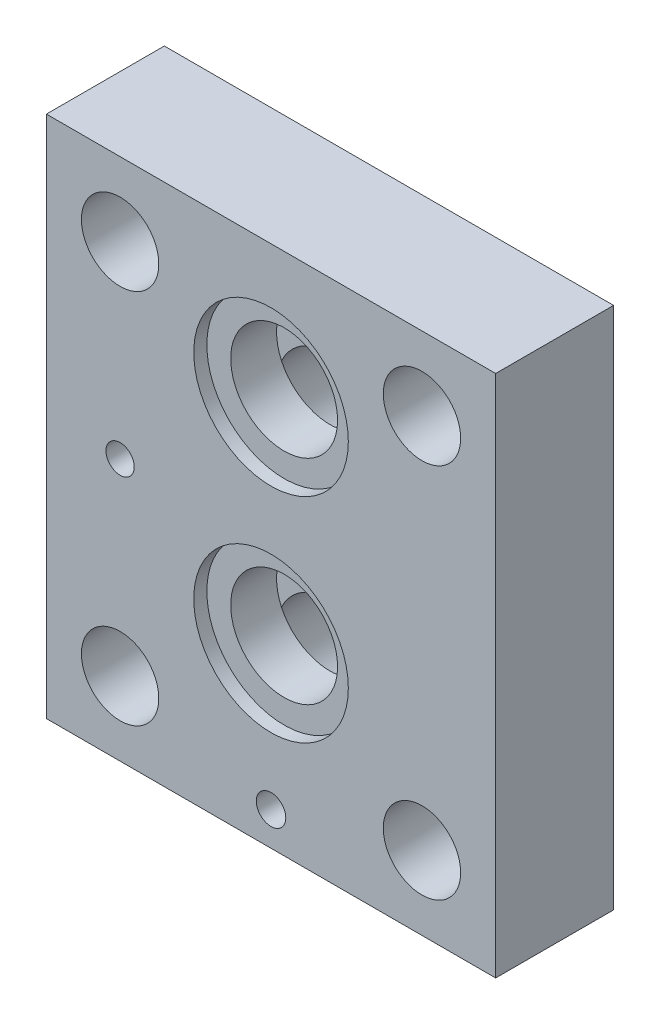
ISO-10303-21;
HEADER;
FILE_DESCRIPTION(('STEP AP214'),'2;1');
FILE_NAME('part.step','',(''),(''),'','','');
FILE_SCHEMA(('AUTOMOTIVE_DESIGN { 1 0 10303 214 1 1 1 1 }'));
ENDSEC;
DATA;
#1=APPLICATION_CONTEXT('core data for automotive mechanical design processes');
#2=APPLICATION_PROTOCOL_DEFINITION('international standard','automotive_design',2000,#1);
#3=PRODUCT_CONTEXT('',#1,'mechanical');
#4=PRODUCT('Part','Part','',(#3));
#5=PRODUCT_RELATED_PRODUCT_CATEGORY('part','',(#4));
#6=PRODUCT_DEFINITION_FORMATION('','',#4);
#7=PRODUCT_DEFINITION_CONTEXT('part definition',#1,'design');
#8=PRODUCT_DEFINITION('design','',#6,#7);
#9=PRODUCT_DEFINITION_SHAPE('','',#8);
#10=(LENGTH_UNIT() NAMED_UNIT(*) SI_UNIT(.MILLI.,.METRE.));
#11=(NAMED_UNIT(*) PLANE_ANGLE_UNIT() SI_UNIT($,.RADIAN.));
#12=(NAMED_UNIT(*) SI_UNIT($,.STERADIAN.) SOLID_ANGLE_UNIT());
#13=UNCERTAINTY_MEASURE_WITH_UNIT(LENGTH_MEASURE(1.E-05),#10,'distance_accuracy_value','');
#14=(GEOMETRIC_REPRESENTATION_CONTEXT(3) GLOBAL_UNCERTAINTY_ASSIGNED_CONTEXT((#13)) GLOBAL_UNIT_ASSIGNED_CONTEXT((#10,
#11,#12)) REPRESENTATION_CONTEXT('',''));
#15=CARTESIAN_POINT('',(0.,0.,0.));
#16=DIRECTION('',(0.,0.,1.));
#17=DIRECTION('',(1.,0.,0.));
#18=AXIS2_PLACEMENT_3D('',#15,#16,#17);
#19=CARTESIAN_POINT('',(0.,27.813,0.));
#20=DIRECTION('',(0.,0.,1.));
#21=DIRECTION('',(1.,0.,0.));
#22=AXIS2_PLACEMENT_3D('',#19,#20,#21);
#23=CYLINDRICAL_SURFACE('',#22,11.509375);
#24=CARTESIAN_POINT('',(0.,27.813,0.));
#25=DIRECTION('',(0.,0.,1.));
#26=DIRECTION('',(1.,0.,0.));
#27=AXIS2_PLACEMENT_3D('',#24,#25,#26);
#28=CIRCLE('',#27,11.509375);
#29=CARTESIAN_POINT('',(-10.4487050341478,22.987,0.));
#30=VERTEX_POINT('',#29);
#31=CARTESIAN_POINT('',(10.4487050341478,22.987,0.));
#32=VERTEX_POINT('',#31);
#33=EDGE_CURVE('E100',#30,#32,#28,.T.);
#34=ORIENTED_EDGE('',*,*,#33,.F.);
#35=EDGE_CURVE('E59',#32,#30,#28,.T.);
#36=ORIENTED_EDGE('',*,*,#35,.F.);
#37=EDGE_LOOP('',(#34,#36));
#38=FACE_BOUND('',#37,.T.);
#39=CARTESIAN_POINT('',(0.,27.813,9.8806));
#40=DIRECTION('',(0.,0.,1.));
#41=DIRECTION('',(1.,0.,0.));
#42=AXIS2_PLACEMENT_3D('',#39,#40,#41);
#43=CIRCLE('',#42,11.509375);
#44=CARTESIAN_POINT('',(11.509375,27.813,9.8806));
#45=VERTEX_POINT('',#44);
#46=EDGE_CURVE('E47',#45,#45,#43,.F.);
#47=ORIENTED_EDGE('',*,*,#46,.F.);
#48=EDGE_LOOP('',(#47));
#49=FACE_BOUND('',#48,.T.);
#50=ADVANCED_FACE('F43',(#38,#49),#23,.F.);
#51=CARTESIAN_POINT('',(0.,-18.161,0.));
#52=DIRECTION('',(0.,0.,1.));
#53=DIRECTION('',(1.,0.,0.));
#54=AXIS2_PLACEMENT_3D('',#51,#52,#53);
#55=CYLINDRICAL_SURFACE('',#54,11.509375);
#56=CARTESIAN_POINT('',(0.,-18.161,0.));
#57=DIRECTION('',(0.,0.,1.));
#58=DIRECTION('',(1.,0.,0.));
#59=AXIS2_PLACEMENT_3D('',#56,#57,#58);
#60=CIRCLE('',#59,11.509375);
#61=CARTESIAN_POINT('',(-10.4487050341478,-22.987,0.));
#62=VERTEX_POINT('',#61);
#63=CARTESIAN_POINT('',(10.4487050341478,-22.987,0.));
#64=VERTEX_POINT('',#63);
#65=EDGE_CURVE('E120',#62,#64,#60,.T.);
#66=ORIENTED_EDGE('',*,*,#65,.F.);
#67=EDGE_CURVE('E66',#64,#62,#60,.T.);
#68=ORIENTED_EDGE('',*,*,#67,.F.);
#69=EDGE_LOOP('',(#66,#68));
#70=FACE_BOUND('',#69,.T.);
#71=CARTESIAN_POINT('',(0.,-18.161,9.8806));
#72=DIRECTION('',(0.,0.,1.));
#73=DIRECTION('',(1.,0.,0.));
#74=AXIS2_PLACEMENT_3D('',#71,#72,#73);
#75=CIRCLE('',#74,11.509375);
#76=CARTESIAN_POINT('',(11.509375,-18.161,9.8806));
#77=VERTEX_POINT('',#76);
#78=EDGE_CURVE('E101',#77,#77,#75,.F.);
#79=ORIENTED_EDGE('',*,*,#78,.F.);
#80=EDGE_LOOP('',(#79));
#81=FACE_BOUND('',#80,.T.);
#82=ADVANCED_FACE('F279',(#70,#81),#55,.F.);
#83=CARTESIAN_POINT('',(48.387,56.388,12.7));
#84=DIRECTION('',(0.,-1.,0.));
#85=DIRECTION('',(0.,0.,-1.));
#86=AXIS2_PLACEMENT_3D('',#83,#84,#85);
#87=PLANE('',#86);
#88=DIRECTION('',(-1.,0.,0.));
#89=VECTOR('',#88,1.);
#90=CARTESIAN_POINT('',(48.387,56.388,-12.7));
#91=LINE('',#90,#89);
#92=CARTESIAN_POINT('',(48.387,56.388,-12.7));
#93=VERTEX_POINT('',#92);
#94=CARTESIAN_POINT('',(-48.387,56.388,-12.7));
#95=VERTEX_POINT('',#94);
#96=EDGE_CURVE('E148',#93,#95,#91,.T.);
#97=ORIENTED_EDGE('',*,*,#96,.T.);
#98=DIRECTION('',(0.,0.,-1.));
#99=VECTOR('',#98,1.);
#100=CARTESIAN_POINT('',(-48.387,56.388,12.7));
#101=LINE('',#100,#99);
#102=CARTESIAN_POINT('',(-48.387,56.388,12.7));
#103=VERTEX_POINT('',#102);
#104=EDGE_CURVE('E11',#103,#95,#101,.T.);
#105=ORIENTED_EDGE('',*,*,#104,.F.);
#106=DIRECTION('',(-1.,0.,0.));
#107=VECTOR('',#106,1.);
#108=CARTESIAN_POINT('',(48.387,56.388,12.7));
#109=LINE('',#108,#107);
#110=CARTESIAN_POINT('',(48.387,56.388,12.7));
#111=VERTEX_POINT('',#110);
#112=EDGE_CURVE('E151',#111,#103,#109,.T.);
#113=ORIENTED_EDGE('',*,*,#112,.F.);
#114=DIRECTION('',(0.,0.,-1.));
#115=VECTOR('',#114,1.);
#116=CARTESIAN_POINT('',(48.387,56.388,12.7));
#117=LINE('',#116,#115);
#118=EDGE_CURVE('E161',#111,#93,#117,.T.);
#119=ORIENTED_EDGE('',*,*,#118,.T.);
#120=EDGE_LOOP('',(#97,#105,#113,#119));
#121=FACE_BOUND('',#120,.T.);
#122=ADVANCED_FACE('F45',(#121),#87,.F.);
#123=CARTESIAN_POINT('',(-48.387,-56.388,12.7));
#124=DIRECTION('',(1.,0.,0.));
#125=DIRECTION('',(0.,0.,-1.));
#126=AXIS2_PLACEMENT_3D('',#123,#124,#125);
#127=PLANE('',#126);
#128=DIRECTION('',(0.,-1.,0.));
#129=VECTOR('',#128,1.);
#130=CARTESIAN_POINT('',(-48.387,-56.388,-12.7));
#131=LINE('',#130,#129);
#132=CARTESIAN_POINT('',(-48.387,-56.388,-12.7));
#133=VERTEX_POINT('',#132);
#134=EDGE_CURVE('E164',#95,#133,#131,.T.);
#135=ORIENTED_EDGE('',*,*,#134,.T.);
#136=DIRECTION('',(0.,0.,-1.));
#137=VECTOR('',#136,1.);
#138=CARTESIAN_POINT('',(-48.387,-56.388,12.7));
#139=LINE('',#138,#137);
#140=CARTESIAN_POINT('',(-48.387,-56.388,12.7));
#141=VERTEX_POINT('',#140);
#142=EDGE_CURVE('E52',#141,#133,#139,.T.);
#143=ORIENTED_EDGE('',*,*,#142,.F.);
#144=DIRECTION('',(0.,-1.,0.));
#145=VECTOR('',#144,1.);
#146=CARTESIAN_POINT('',(-48.387,-56.388,12.7));
#147=LINE('',#146,#145);
#148=EDGE_CURVE('E154',#103,#141,#147,.T.);
#149=ORIENTED_EDGE('',*,*,#148,.F.);
#150=ORIENTED_EDGE('',*,*,#104,.T.);
#151=EDGE_LOOP('',(#135,#143,#149,#150));
#152=FACE_BOUND('',#151,.T.);
#153=ADVANCED_FACE('F255',(#152),#127,.F.);
#154=CARTESIAN_POINT('',(48.387,-56.388,12.7));
#155=DIRECTION('',(0.,1.,0.));
#156=DIRECTION('',(0.,0.,1.));
#157=AXIS2_PLACEMENT_3D('',#154,#155,#156);
#158=PLANE('',#157);
#159=DIRECTION('',(1.,0.,0.));
#160=VECTOR('',#159,1.);
#161=CARTESIAN_POINT('',(48.387,-56.388,-12.7));
#162=LINE('',#161,#160);
#163=CARTESIAN_POINT('',(48.387,-56.388,-12.7));
#164=VERTEX_POINT('',#163);
#165=EDGE_CURVE('E166',#133,#164,#162,.T.);
#166=ORIENTED_EDGE('',*,*,#165,.T.);
#167=DIRECTION('',(0.,0.,-1.));
#168=VECTOR('',#167,1.);
#169=CARTESIAN_POINT('',(48.387,-56.388,12.7));
#170=LINE('',#169,#168);
#171=CARTESIAN_POINT('',(48.387,-56.388,12.7));
#172=VERTEX_POINT('',#171);
#173=EDGE_CURVE('E171',#172,#164,#170,.T.);
#174=ORIENTED_EDGE('',*,*,#173,.F.);
#175=DIRECTION('',(1.,0.,0.));
#176=VECTOR('',#175,1.);
#177=CARTESIAN_POINT('',(48.387,-56.388,12.7));
#178=LINE('',#177,#176);
#179=EDGE_CURVE('E157',#141,#172,#178,.T.);
#180=ORIENTED_EDGE('',*,*,#179,.F.);
#181=ORIENTED_EDGE('',*,*,#142,.T.);
#182=EDGE_LOOP('',(#166,#174,#180,#181));
#183=FACE_BOUND('',#182,.T.);
#184=ADVANCED_FACE('F260',(#183),#158,.F.);
#185=CARTESIAN_POINT('',(48.387,-56.388,12.7));
#186=DIRECTION('',(-1.,0.,0.));
#187=DIRECTION('',(0.,0.,1.));
#188=AXIS2_PLACEMENT_3D('',#185,#186,#187);
#189=PLANE('',#188);
#190=DIRECTION('',(0.,1.,0.));
#191=VECTOR('',#190,1.);
#192=CARTESIAN_POINT('',(48.387,-56.388,-12.7));
#193=LINE('',#192,#191);
#194=EDGE_CURVE('E155',#164,#93,#193,.T.);
#195=ORIENTED_EDGE('',*,*,#194,.T.);
#196=ORIENTED_EDGE('',*,*,#118,.F.);
#197=DIRECTION('',(0.,1.,0.));
#198=VECTOR('',#197,1.);
#199=CARTESIAN_POINT('',(48.387,-56.388,12.7));
#200=LINE('',#199,#198);
#201=EDGE_CURVE('E159',#172,#111,#200,.T.);
#202=ORIENTED_EDGE('',*,*,#201,.F.);
#203=ORIENTED_EDGE('',*,*,#173,.T.);
#204=EDGE_LOOP('',(#195,#196,#202,#203));
#205=FACE_BOUND('',#204,.T.);
#206=ADVANCED_FACE('F231',(#205),#189,.F.);
#207=CARTESIAN_POINT('',(0.,0.,12.7));
#208=DIRECTION('',(0.,0.,-1.));
#209=DIRECTION('',(-1.,0.,0.));
#210=AXIS2_PLACEMENT_3D('',#207,#208,#209);
#211=PLANE('',#210);
#212=CARTESIAN_POINT('',(-32.512,0.,12.7));
#213=DIRECTION('',(0.,0.,1.));
#214=DIRECTION('',(1.,0.,0.));
#215=AXIS2_PLACEMENT_3D('',#212,#213,#214);
#216=CIRCLE('',#215,3.04799999999999);
#217=CARTESIAN_POINT('',(-29.464,0.,12.7));
#218=VERTEX_POINT('',#217);
#219=EDGE_CURVE('E212',#218,#218,#216,.T.);
#220=ORIENTED_EDGE('',*,*,#219,.F.);
#221=EDGE_LOOP('',(#220));
#222=FACE_BOUND('',#221,.T.);
#223=CARTESIAN_POINT('',(0.,-49.149,12.7));
#224=DIRECTION('',(0.,0.,1.));
#225=DIRECTION('',(1.,0.,0.));
#226=AXIS2_PLACEMENT_3D('',#223,#224,#225);
#227=CIRCLE('',#226,3.175);
#228=CARTESIAN_POINT('',(3.175,-49.149,12.7));
#229=VERTEX_POINT('',#228);
#230=EDGE_CURVE('E206',#229,#229,#227,.T.);
#231=ORIENTED_EDGE('',*,*,#230,.F.);
#232=EDGE_LOOP('',(#231));
#233=FACE_BOUND('',#232,.T.);
#234=CARTESIAN_POINT('',(0.,27.813,12.7));
#235=DIRECTION('',(0.,0.,1.));
#236=DIRECTION('',(1.,0.,0.));
#237=AXIS2_PLACEMENT_3D('',#234,#235,#236);
#238=CIRCLE('',#237,16.6497);
#239=CARTESIAN_POINT('',(16.6497,27.813,12.7));
#240=VERTEX_POINT('',#239);
#241=EDGE_CURVE('E187',#240,#240,#238,.T.);
#242=ORIENTED_EDGE('',*,*,#241,.F.);
#243=EDGE_LOOP('',(#242));
#244=FACE_BOUND('',#243,.T.);
#245=CARTESIAN_POINT('',(0.,-18.161,12.7));
#246=DIRECTION('',(0.,0.,1.));
#247=DIRECTION('',(1.,0.,0.));
#248=AXIS2_PLACEMENT_3D('',#245,#246,#247);
#249=CIRCLE('',#248,16.6497);
#250=CARTESIAN_POINT('',(16.6497,-18.161,12.7));
#251=VERTEX_POINT('',#250);
#252=EDGE_CURVE('E180',#251,#251,#249,.T.);
#253=ORIENTED_EDGE('',*,*,#252,.F.);
#254=EDGE_LOOP('',(#253));
#255=FACE_BOUND('',#254,.T.);
#256=CARTESIAN_POINT('',(32.512,40.513,12.7));
#257=DIRECTION('',(0.,0.,-1.));
#258=DIRECTION('',(-1.,0.,0.));
#259=AXIS2_PLACEMENT_3D('',#256,#257,#258);
#260=CIRCLE('',#259,8.334375);
#261=CARTESIAN_POINT('',(24.177625,40.513,12.7));
#262=VERTEX_POINT('',#261);
#263=EDGE_CURVE('E131',#262,#262,#260,.T.);
#264=ORIENTED_EDGE('',*,*,#263,.T.);
#265=EDGE_LOOP('',(#264));
#266=FACE_BOUND('',#265,.T.);
#267=CARTESIAN_POINT('',(-32.512,-40.513,12.7));
#268=DIRECTION('',(0.,0.,-1.));
#269=DIRECTION('',(-1.,0.,0.));
#270=AXIS2_PLACEMENT_3D('',#267,#268,#269);
#271=CIRCLE('',#270,8.334375);
#272=CARTESIAN_POINT('',(-40.846375,-40.513,12.7));
#273=VERTEX_POINT('',#272);
#274=EDGE_CURVE('E134',#273,#273,#271,.T.);
#275=ORIENTED_EDGE('',*,*,#274,.T.);
#276=EDGE_LOOP('',(#275));
#277=FACE_BOUND('',#276,.T.);
#278=CARTESIAN_POINT('',(-32.512,40.513,12.7));
#279=DIRECTION('',(0.,0.,-1.));
#280=DIRECTION('',(-1.,0.,0.));
#281=AXIS2_PLACEMENT_3D('',#278,#279,#280);
#282=CIRCLE('',#281,8.334375);
#283=CARTESIAN_POINT('',(-40.846375,40.513,12.7));
#284=VERTEX_POINT('',#283);
#285=EDGE_CURVE('E140',#284,#284,#282,.T.);
#286=ORIENTED_EDGE('',*,*,#285,.T.);
#287=EDGE_LOOP('',(#286));
#288=FACE_BOUND('',#287,.T.);
#289=CARTESIAN_POINT('',(32.512,-40.513,12.7));
#290=DIRECTION('',(0.,0.,-1.));
#291=DIRECTION('',(-1.,0.,0.));
#292=AXIS2_PLACEMENT_3D('',#289,#290,#291);
#293=CIRCLE('',#292,8.334375);
#294=CARTESIAN_POINT('',(24.177625,-40.513,12.7));
#295=VERTEX_POINT('',#294);
#296=EDGE_CURVE('E130',#295,#295,#293,.T.);
#297=ORIENTED_EDGE('',*,*,#296,.T.);
#298=EDGE_LOOP('',(#297));
#299=FACE_BOUND('',#298,.T.);
#300=ORIENTED_EDGE('',*,*,#112,.T.);
#301=ORIENTED_EDGE('',*,*,#148,.T.);
#302=ORIENTED_EDGE('',*,*,#179,.T.);
#303=ORIENTED_EDGE('',*,*,#201,.T.);
#304=EDGE_LOOP('',(#300,#301,#302,#303));
#305=FACE_BOUND('',#304,.T.);
#306=ADVANCED_FACE('F227',(#222,#233,#244,#255,#266,#277,#288,#299,#305),#211,.F.);
#307=CARTESIAN_POINT('',(0.,0.,-12.7));
#308=DIRECTION('',(0.,0.,-1.));
#309=DIRECTION('',(-1.,0.,0.));
#310=AXIS2_PLACEMENT_3D('',#307,#308,#309);
#311=PLANE('',#310);
#312=CARTESIAN_POINT('',(32.512,0.,-12.7));
#313=DIRECTION('',(0.,0.,1.));
#314=DIRECTION('',(1.,0.,0.));
#315=AXIS2_PLACEMENT_3D('',#312,#313,#314);
#316=CIRCLE('',#315,3.69887499999999);
#317=CARTESIAN_POINT('',(36.210875,0.,-12.7));
#318=VERTEX_POINT('',#317);
#319=EDGE_CURVE('E200',#318,#318,#316,.T.);
#320=ORIENTED_EDGE('',*,*,#319,.T.);
#321=EDGE_LOOP('',(#320));
#322=FACE_BOUND('',#321,.T.);
#323=CARTESIAN_POINT('',(0.,49.149,-12.7));
#324=DIRECTION('',(0.,0.,1.));
#325=DIRECTION('',(1.,0.,0.));
#326=AXIS2_PLACEMENT_3D('',#323,#324,#325);
#327=CIRCLE('',#326,3.571875);
#328=CARTESIAN_POINT('',(3.571875,49.149,-12.7));
#329=VERTEX_POINT('',#328);
#330=EDGE_CURVE('E194',#329,#329,#327,.T.);
#331=ORIENTED_EDGE('',*,*,#330,.T.);
#332=EDGE_LOOP('',(#331));
#333=FACE_BOUND('',#332,.T.);
#334=CARTESIAN_POINT('',(0.,18.161,-12.7));
#335=DIRECTION('',(0.,0.,1.));
#336=DIRECTION('',(1.,0.,0.));
#337=AXIS2_PLACEMENT_3D('',#334,#335,#336);
#338=CIRCLE('',#337,11.509375);
#339=CARTESIAN_POINT('',(11.509375,18.161,-12.7));
#340=VERTEX_POINT('',#339);
#341=EDGE_CURVE('E110',#340,#340,#338,.T.);
#342=ORIENTED_EDGE('',*,*,#341,.T.);
#343=EDGE_LOOP('',(#342));
#344=FACE_BOUND('',#343,.T.);
#345=CARTESIAN_POINT('',(0.,-27.813,-12.7));
#346=DIRECTION('',(0.,0.,1.));
#347=DIRECTION('',(1.,0.,0.));
#348=AXIS2_PLACEMENT_3D('',#345,#346,#347);
#349=CIRCLE('',#348,11.509375);
#350=CARTESIAN_POINT('',(11.509375,-27.813,-12.7));
#351=VERTEX_POINT('',#350);
#352=EDGE_CURVE('E114',#351,#351,#349,.T.);
#353=ORIENTED_EDGE('',*,*,#352,.T.);
#354=EDGE_LOOP('',(#353));
#355=FACE_BOUND('',#354,.T.);
#356=CARTESIAN_POINT('',(32.512,40.513,-12.7));
#357=DIRECTION('',(0.,0.,1.));
#358=DIRECTION('',(1.,0.,0.));
#359=AXIS2_PLACEMENT_3D('',#356,#357,#358);
#360=CIRCLE('',#359,8.334375);
#361=CARTESIAN_POINT('',(24.177625,40.513,-12.7));
#362=VERTEX_POINT('',#361);
#363=EDGE_CURVE('E127',#362,#362,#360,.T.);
#364=ORIENTED_EDGE('',*,*,#363,.T.);
#365=EDGE_LOOP('',(#364));
#366=FACE_BOUND('',#365,.T.);
#367=CARTESIAN_POINT('',(-32.512,-40.513,-12.7));
#368=DIRECTION('',(0.,0.,1.));
#369=DIRECTION('',(1.,0.,0.));
#370=AXIS2_PLACEMENT_3D('',#367,#368,#369);
#371=CIRCLE('',#370,8.334375);
#372=CARTESIAN_POINT('',(-40.846375,-40.513,-12.7));
#373=VERTEX_POINT('',#372);
#374=EDGE_CURVE('E137',#373,#373,#371,.T.);
#375=ORIENTED_EDGE('',*,*,#374,.T.);
#376=EDGE_LOOP('',(#375));
#377=FACE_BOUND('',#376,.T.);
#378=CARTESIAN_POINT('',(-32.512,40.513,-12.7));
#379=DIRECTION('',(0.,0.,1.));
#380=DIRECTION('',(1.,0.,0.));
#381=AXIS2_PLACEMENT_3D('',#378,#379,#380);
#382=CIRCLE('',#381,8.334375);
#383=CARTESIAN_POINT('',(-40.846375,40.513,-12.7));
#384=VERTEX_POINT('',#383);
#385=EDGE_CURVE('E125',#384,#384,#382,.T.);
#386=ORIENTED_EDGE('',*,*,#385,.T.);
#387=EDGE_LOOP('',(#386));
#388=FACE_BOUND('',#387,.T.);
#389=CARTESIAN_POINT('',(32.512,-40.513,-12.7));
#390=DIRECTION('',(0.,0.,1.));
#391=DIRECTION('',(1.,0.,0.));
#392=AXIS2_PLACEMENT_3D('',#389,#390,#391);
#393=CIRCLE('',#392,8.334375);
#394=CARTESIAN_POINT('',(24.177625,-40.513,-12.7));
#395=VERTEX_POINT('',#394);
#396=EDGE_CURVE('E145',#395,#395,#393,.T.);
#397=ORIENTED_EDGE('',*,*,#396,.T.);
#398=EDGE_LOOP('',(#397));
#399=FACE_BOUND('',#398,.T.);
#400=ORIENTED_EDGE('',*,*,#96,.F.);
#401=ORIENTED_EDGE('',*,*,#194,.F.);
#402=ORIENTED_EDGE('',*,*,#165,.F.);
#403=ORIENTED_EDGE('',*,*,#134,.F.);
#404=EDGE_LOOP('',(#400,#401,#402,#403));
#405=FACE_BOUND('',#404,.T.);
#406=ADVANCED_FACE('F230',(#322,#333,#344,#355,#366,#377,#388,#399,#405),#311,.T.);
#407=CARTESIAN_POINT('',(32.512,-40.513,12.701));
#408=DIRECTION('',(0.,0.,-1.));
#409=DIRECTION('',(-1.,0.,0.));
#410=AXIS2_PLACEMENT_3D('',#407,#408,#409);
#411=CYLINDRICAL_SURFACE('',#410,8.334375);
#412=CARTESIAN_POINT('',(24.177625,-40.513,-12.7));
#413=CARTESIAN_POINT('',(24.177625,-40.513,-12.4354166666667));
#414=CARTESIAN_POINT('',(24.177625,-40.513,-12.1708333333333));
#415=CARTESIAN_POINT('',(24.177625,-40.513,-11.6416666666667));
#416=CARTESIAN_POINT('',(24.177625,-40.513,-11.3770833333333));
#417=CARTESIAN_POINT('',(24.177625,-40.513,-10.8479166666667));
#418=CARTESIAN_POINT('',(24.177625,-40.513,-10.5833333333333));
#419=CARTESIAN_POINT('',(24.177625,-40.513,-10.0541666666667));
#420=CARTESIAN_POINT('',(24.177625,-40.513,-9.78958333333334));
#421=CARTESIAN_POINT('',(24.177625,-40.513,-9.26041666666667));
#422=CARTESIAN_POINT('',(24.177625,-40.513,-8.99583333333334));
#423=CARTESIAN_POINT('',(24.177625,-40.513,-8.46666666666667));
#424=CARTESIAN_POINT('',(24.177625,-40.513,-8.20208333333333));
#425=CARTESIAN_POINT('',(24.177625,-40.513,-7.67291666666667));
#426=CARTESIAN_POINT('',(24.177625,-40.513,-7.40833333333333));
#427=CARTESIAN_POINT('',(24.177625,-40.513,-6.87916666666667));
#428=CARTESIAN_POINT('',(24.177625,-40.513,-6.61458333333333));
#429=CARTESIAN_POINT('',(24.177625,-40.513,-6.08541666666667));
#430=CARTESIAN_POINT('',(24.177625,-40.513,-5.82083333333333));
#431=CARTESIAN_POINT('',(24.177625,-40.513,-5.29166666666667));
#432=CARTESIAN_POINT('',(24.177625,-40.513,-5.02708333333334));
#433=CARTESIAN_POINT('',(24.177625,-40.513,-4.49791666666667));
#434=CARTESIAN_POINT('',(24.177625,-40.513,-4.23333333333333));
#435=CARTESIAN_POINT('',(24.177625,-40.513,-3.70416666666667));
#436=CARTESIAN_POINT('',(24.177625,-40.513,-3.43958333333333));
#437=CARTESIAN_POINT('',(24.177625,-40.513,-2.91041666666667));
#438=CARTESIAN_POINT('',(24.177625,-40.513,-2.64583333333334));
#439=CARTESIAN_POINT('',(24.177625,-40.513,-2.11666666666667));
#440=CARTESIAN_POINT('',(24.177625,-40.513,-1.85208333333334));
#441=CARTESIAN_POINT('',(24.177625,-40.513,-1.32291666666667));
#442=CARTESIAN_POINT('',(24.177625,-40.513,-1.05833333333333));
#443=CARTESIAN_POINT('',(24.177625,-40.513,-0.529166666666668));
#444=CARTESIAN_POINT('',(24.177625,-40.513,-0.264583333333335));
#445=CARTESIAN_POINT('',(24.177625,-40.513,0.264583333333331));
#446=CARTESIAN_POINT('',(24.177625,-40.513,0.529166666666664));
#447=CARTESIAN_POINT('',(24.177625,-40.513,1.05833333333333));
#448=CARTESIAN_POINT('',(24.177625,-40.513,1.32291666666666));
#449=CARTESIAN_POINT('',(24.177625,-40.513,1.85208333333333));
#450=CARTESIAN_POINT('',(24.177625,-40.513,2.11666666666667));
#451=CARTESIAN_POINT('',(24.177625,-40.513,2.64583333333333));
#452=CARTESIAN_POINT('',(24.177625,-40.513,2.91041666666667));
#453=CARTESIAN_POINT('',(24.177625,-40.513,3.43958333333333));
#454=CARTESIAN_POINT('',(24.177625,-40.513,3.70416666666667));
#455=CARTESIAN_POINT('',(24.177625,-40.513,4.23333333333333));
#456=CARTESIAN_POINT('',(24.177625,-40.513,4.49791666666667));
#457=CARTESIAN_POINT('',(24.177625,-40.513,5.02708333333333));
#458=CARTESIAN_POINT('',(24.177625,-40.513,5.29166666666667));
#459=CARTESIAN_POINT('',(24.177625,-40.513,5.82083333333333));
#460=CARTESIAN_POINT('',(24.177625,-40.513,6.08541666666667));
#461=CARTESIAN_POINT('',(24.177625,-40.513,6.61458333333333));
#462=CARTESIAN_POINT('',(24.177625,-40.513,6.87916666666667));
#463=CARTESIAN_POINT('',(24.177625,-40.513,7.40833333333333));
#464=CARTESIAN_POINT('',(24.177625,-40.513,7.67291666666666));
#465=CARTESIAN_POINT('',(24.177625,-40.513,8.20208333333333));
#466=CARTESIAN_POINT('',(24.177625,-40.513,8.46666666666667));
#467=CARTESIAN_POINT('',(24.177625,-40.513,8.99583333333333));
#468=CARTESIAN_POINT('',(24.177625,-40.513,9.26041666666666));
#469=CARTESIAN_POINT('',(24.177625,-40.513,9.78958333333333));
#470=CARTESIAN_POINT('',(24.177625,-40.513,10.0541666666667));
#471=CARTESIAN_POINT('',(24.177625,-40.513,10.5833333333333));
#472=CARTESIAN_POINT('',(24.177625,-40.513,10.8479166666667));
#473=CARTESIAN_POINT('',(24.177625,-40.513,11.3770833333333));
#474=CARTESIAN_POINT('',(24.177625,-40.513,11.6416666666667));
#475=CARTESIAN_POINT('',(24.177625,-40.513,12.1708333333333));
#476=CARTESIAN_POINT('',(24.177625,-40.513,12.4354166666667));
#477=CARTESIAN_POINT('',(24.177625,-40.513,12.7));
#478=B_SPLINE_CURVE_WITH_KNOTS('',3,(#412,#413,#414,#415,#416,#417,#418,#419,#420,#421,#422,
#423,#424,#425,#426,#427,#428,#429,#430,#431,#432,#433,#434,#435,#436,#437,#438,#439,#440,#441,
#442,#443,#444,#445,#446,#447,#448,#449,#450,#451,#452,#453,#454,#455,#456,#457,#458,#459,#460,
#461,#462,#463,#464,#465,#466,#467,#468,#469,#470,#471,#472,#473,#474,#475,#476,#477),
.UNSPECIFIED.,.F.,.F.,(4,2,2,2,2,2,2,2,2,2,2,2,2,2,2,2,2,2,2,2,2,2,2,2,2,2,2,2,2,2,2,2,4),(0.,
0.793749999999999,1.5875,2.38125,3.175,3.96875,4.7625,5.55625,6.35,7.14375,7.9375,8.73125,9.525,
10.31875,11.1125,11.90625,12.7,13.49375,14.2875,15.08125,15.875,16.66875,17.4625,18.25625,19.05,
19.84375,20.6375,21.43125,22.225,23.01875,23.8125,24.60625,25.4),.UNSPECIFIED.);
#479=EDGE_CURVE('BSEAM265',#395,#295,#478,.T.);
#480=ORIENTED_EDGE('',*,*,#396,.F.);
#481=ORIENTED_EDGE('',*,*,#296,.F.);
#482=ORIENTED_EDGE('',*,*,#479,.T.);
#483=ORIENTED_EDGE('',*,*,#479,.F.);
#484=EDGE_LOOP('',(#480,#482,#481,#483));
#485=FACE_BOUND('',#484,.T.);
#486=ADVANCED_FACE('F265',(#485),#411,.F.);
#487=CARTESIAN_POINT('',(-32.512,40.513,12.701));
#488=DIRECTION('',(0.,0.,-1.));
#489=DIRECTION('',(-1.,0.,0.));
#490=AXIS2_PLACEMENT_3D('',#487,#488,#489);
#491=CYLINDRICAL_SURFACE('',#490,8.334375);
#492=CARTESIAN_POINT('',(-40.846375,40.513,-12.7));
#493=CARTESIAN_POINT('',(-40.846375,40.513,-12.4354166666667));
#494=CARTESIAN_POINT('',(-40.846375,40.513,-12.1708333333333));
#495=CARTESIAN_POINT('',(-40.846375,40.513,-11.6416666666667));
#496=CARTESIAN_POINT('',(-40.846375,40.513,-11.3770833333333));
#497=CARTESIAN_POINT('',(-40.846375,40.513,-10.8479166666667));
#498=CARTESIAN_POINT('',(-40.846375,40.513,-10.5833333333333));
#499=CARTESIAN_POINT('',(-40.846375,40.513,-10.0541666666667));
#500=CARTESIAN_POINT('',(-40.846375,40.513,-9.78958333333334));
#501=CARTESIAN_POINT('',(-40.846375,40.513,-9.26041666666667));
#502=CARTESIAN_POINT('',(-40.846375,40.513,-8.99583333333334));
#503=CARTESIAN_POINT('',(-40.846375,40.513,-8.46666666666667));
#504=CARTESIAN_POINT('',(-40.846375,40.513,-8.20208333333333));
#505=CARTESIAN_POINT('',(-40.846375,40.513,-7.67291666666667));
#506=CARTESIAN_POINT('',(-40.846375,40.513,-7.40833333333333));
#507=CARTESIAN_POINT('',(-40.846375,40.513,-6.87916666666667));
#508=CARTESIAN_POINT('',(-40.846375,40.513,-6.61458333333333));
#509=CARTESIAN_POINT('',(-40.846375,40.513,-6.08541666666667));
#510=CARTESIAN_POINT('',(-40.846375,40.513,-5.82083333333333));
#511=CARTESIAN_POINT('',(-40.846375,40.513,-5.29166666666667));
#512=CARTESIAN_POINT('',(-40.846375,40.513,-5.02708333333334));
#513=CARTESIAN_POINT('',(-40.846375,40.513,-4.49791666666667));
#514=CARTESIAN_POINT('',(-40.846375,40.513,-4.23333333333333));
#515=CARTESIAN_POINT('',(-40.846375,40.513,-3.70416666666667));
#516=CARTESIAN_POINT('',(-40.846375,40.513,-3.43958333333333));
#517=CARTESIAN_POINT('',(-40.846375,40.513,-2.91041666666667));
#518=CARTESIAN_POINT('',(-40.846375,40.513,-2.64583333333334));
#519=CARTESIAN_POINT('',(-40.846375,40.513,-2.11666666666667));
#520=CARTESIAN_POINT('',(-40.846375,40.513,-1.85208333333334));
#521=CARTESIAN_POINT('',(-40.846375,40.513,-1.32291666666667));
#522=CARTESIAN_POINT('',(-40.846375,40.513,-1.05833333333333));
#523=CARTESIAN_POINT('',(-40.846375,40.513,-0.529166666666668));
#524=CARTESIAN_POINT('',(-40.846375,40.513,-0.264583333333335));
#525=CARTESIAN_POINT('',(-40.846375,40.513,0.264583333333331));
#526=CARTESIAN_POINT('',(-40.846375,40.513,0.529166666666664));
#527=CARTESIAN_POINT('',(-40.846375,40.513,1.05833333333333));
#528=CARTESIAN_POINT('',(-40.846375,40.513,1.32291666666666));
#529=CARTESIAN_POINT('',(-40.846375,40.513,1.85208333333333));
#530=CARTESIAN_POINT('',(-40.846375,40.513,2.11666666666667));
#531=CARTESIAN_POINT('',(-40.846375,40.513,2.64583333333333));
#532=CARTESIAN_POINT('',(-40.846375,40.513,2.91041666666667));
#533=CARTESIAN_POINT('',(-40.846375,40.513,3.43958333333333));
#534=CARTESIAN_POINT('',(-40.846375,40.513,3.70416666666667));
#535=CARTESIAN_POINT('',(-40.846375,40.513,4.23333333333333));
#536=CARTESIAN_POINT('',(-40.846375,40.513,4.49791666666667));
#537=CARTESIAN_POINT('',(-40.846375,40.513,5.02708333333333));
#538=CARTESIAN_POINT('',(-40.846375,40.513,5.29166666666667));
#539=CARTESIAN_POINT('',(-40.846375,40.513,5.82083333333333));
#540=CARTESIAN_POINT('',(-40.846375,40.513,6.08541666666667));
#541=CARTESIAN_POINT('',(-40.846375,40.513,6.61458333333333));
#542=CARTESIAN_POINT('',(-40.846375,40.513,6.87916666666667));
#543=CARTESIAN_POINT('',(-40.846375,40.513,7.40833333333333));
#544=CARTESIAN_POINT('',(-40.846375,40.513,7.67291666666666));
#545=CARTESIAN_POINT('',(-40.846375,40.513,8.20208333333333));
#546=CARTESIAN_POINT('',(-40.846375,40.513,8.46666666666667));
#547=CARTESIAN_POINT('',(-40.846375,40.513,8.99583333333333));
#548=CARTESIAN_POINT('',(-40.846375,40.513,9.26041666666666));
#549=CARTESIAN_POINT('',(-40.846375,40.513,9.78958333333333));
#550=CARTESIAN_POINT('',(-40.846375,40.513,10.0541666666667));
#551=CARTESIAN_POINT('',(-40.846375,40.513,10.5833333333333));
#552=CARTESIAN_POINT('',(-40.846375,40.513,10.8479166666667));
#553=CARTESIAN_POINT('',(-40.846375,40.513,11.3770833333333));
#554=CARTESIAN_POINT('',(-40.846375,40.513,11.6416666666667));
#555=CARTESIAN_POINT('',(-40.846375,40.513,12.1708333333333));
#556=CARTESIAN_POINT('',(-40.846375,40.513,12.4354166666667));
#557=CARTESIAN_POINT('',(-40.846375,40.513,12.7));
#558=B_SPLINE_CURVE_WITH_KNOTS('',3,(#492,#493,#494,#495,#496,#497,#498,#499,#500,#501,#502,
#503,#504,#505,#506,#507,#508,#509,#510,#511,#512,#513,#514,#515,#516,#517,#518,#519,#520,#521,
#522,#523,#524,#525,#526,#527,#528,#529,#530,#531,#532,#533,#534,#535,#536,#537,#538,#539,#540,
#541,#542,#543,#544,#545,#546,#547,#548,#549,#550,#551,#552,#553,#554,#555,#556,#557),
.UNSPECIFIED.,.F.,.F.,(4,2,2,2,2,2,2,2,2,2,2,2,2,2,2,2,2,2,2,2,2,2,2,2,2,2,2,2,2,2,2,2,4),(0.,
0.793749999999999,1.5875,2.38125,3.175,3.96875,4.7625,5.55625,6.35,7.14375,7.9375,8.73125,9.525,
10.31875,11.1125,11.90625,12.7,13.49375,14.2875,15.08125,15.875,16.66875,17.4625,18.25625,19.05,
19.84375,20.6375,21.43125,22.225,23.01875,23.8125,24.60625,25.4),.UNSPECIFIED.);
#559=EDGE_CURVE('BSEAM273',#384,#284,#558,.T.);
#560=ORIENTED_EDGE('',*,*,#385,.F.);
#561=ORIENTED_EDGE('',*,*,#285,.F.);
#562=ORIENTED_EDGE('',*,*,#559,.T.);
#563=ORIENTED_EDGE('',*,*,#559,.F.);
#564=EDGE_LOOP('',(#560,#562,#561,#563));
#565=FACE_BOUND('',#564,.T.);
#566=ADVANCED_FACE('F273',(#565),#491,.F.);
#567=CARTESIAN_POINT('',(-32.512,-40.513,12.701));
#568=DIRECTION('',(0.,0.,-1.));
#569=DIRECTION('',(-1.,0.,0.));
#570=AXIS2_PLACEMENT_3D('',#567,#568,#569);
#571=CYLINDRICAL_SURFACE('',#570,8.334375);
#572=CARTESIAN_POINT('',(-40.846375,-40.513,-12.7));
#573=CARTESIAN_POINT('',(-40.846375,-40.513,-12.4354166666667));
#574=CARTESIAN_POINT('',(-40.846375,-40.513,-12.1708333333333));
#575=CARTESIAN_POINT('',(-40.846375,-40.513,-11.6416666666667));
#576=CARTESIAN_POINT('',(-40.846375,-40.513,-11.3770833333333));
#577=CARTESIAN_POINT('',(-40.846375,-40.513,-10.8479166666667));
#578=CARTESIAN_POINT('',(-40.846375,-40.513,-10.5833333333333));
#579=CARTESIAN_POINT('',(-40.846375,-40.513,-10.0541666666667));
#580=CARTESIAN_POINT('',(-40.846375,-40.513,-9.78958333333334));
#581=CARTESIAN_POINT('',(-40.846375,-40.513,-9.26041666666667));
#582=CARTESIAN_POINT('',(-40.846375,-40.513,-8.99583333333334));
#583=CARTESIAN_POINT('',(-40.846375,-40.513,-8.46666666666667));
#584=CARTESIAN_POINT('',(-40.846375,-40.513,-8.20208333333333));
#585=CARTESIAN_POINT('',(-40.846375,-40.513,-7.67291666666667));
#586=CARTESIAN_POINT('',(-40.846375,-40.513,-7.40833333333333));
#587=CARTESIAN_POINT('',(-40.846375,-40.513,-6.87916666666667));
#588=CARTESIAN_POINT('',(-40.846375,-40.513,-6.61458333333333));
#589=CARTESIAN_POINT('',(-40.846375,-40.513,-6.08541666666667));
#590=CARTESIAN_POINT('',(-40.846375,-40.513,-5.82083333333333));
#591=CARTESIAN_POINT('',(-40.846375,-40.513,-5.29166666666667));
#592=CARTESIAN_POINT('',(-40.846375,-40.513,-5.02708333333334));
#593=CARTESIAN_POINT('',(-40.846375,-40.513,-4.49791666666667));
#594=CARTESIAN_POINT('',(-40.846375,-40.513,-4.23333333333333));
#595=CARTESIAN_POINT('',(-40.846375,-40.513,-3.70416666666667));
#596=CARTESIAN_POINT('',(-40.846375,-40.513,-3.43958333333333));
#597=CARTESIAN_POINT('',(-40.846375,-40.513,-2.91041666666667));
#598=CARTESIAN_POINT('',(-40.846375,-40.513,-2.64583333333334));
#599=CARTESIAN_POINT('',(-40.846375,-40.513,-2.11666666666667));
#600=CARTESIAN_POINT('',(-40.846375,-40.513,-1.85208333333334));
#601=CARTESIAN_POINT('',(-40.846375,-40.513,-1.32291666666667));
#602=CARTESIAN_POINT('',(-40.846375,-40.513,-1.05833333333333));
#603=CARTESIAN_POINT('',(-40.846375,-40.513,-0.529166666666668));
#604=CARTESIAN_POINT('',(-40.846375,-40.513,-0.264583333333335));
#605=CARTESIAN_POINT('',(-40.846375,-40.513,0.264583333333331));
#606=CARTESIAN_POINT('',(-40.846375,-40.513,0.529166666666664));
#607=CARTESIAN_POINT('',(-40.846375,-40.513,1.05833333333333));
#608=CARTESIAN_POINT('',(-40.846375,-40.513,1.32291666666666));
#609=CARTESIAN_POINT('',(-40.846375,-40.513,1.85208333333333));
#610=CARTESIAN_POINT('',(-40.846375,-40.513,2.11666666666667));
#611=CARTESIAN_POINT('',(-40.846375,-40.513,2.64583333333333));
#612=CARTESIAN_POINT('',(-40.846375,-40.513,2.91041666666667));
#613=CARTESIAN_POINT('',(-40.846375,-40.513,3.43958333333333));
#614=CARTESIAN_POINT('',(-40.846375,-40.513,3.70416666666667));
#615=CARTESIAN_POINT('',(-40.846375,-40.513,4.23333333333333));
#616=CARTESIAN_POINT('',(-40.846375,-40.513,4.49791666666667));
#617=CARTESIAN_POINT('',(-40.846375,-40.513,5.02708333333333));
#618=CARTESIAN_POINT('',(-40.846375,-40.513,5.29166666666667));
#619=CARTESIAN_POINT('',(-40.846375,-40.513,5.82083333333333));
#620=CARTESIAN_POINT('',(-40.846375,-40.513,6.08541666666667));
#621=CARTESIAN_POINT('',(-40.846375,-40.513,6.61458333333333));
#622=CARTESIAN_POINT('',(-40.846375,-40.513,6.87916666666667));
#623=CARTESIAN_POINT('',(-40.846375,-40.513,7.40833333333333));
#624=CARTESIAN_POINT('',(-40.846375,-40.513,7.67291666666666));
#625=CARTESIAN_POINT('',(-40.846375,-40.513,8.20208333333333));
#626=CARTESIAN_POINT('',(-40.846375,-40.513,8.46666666666667));
#627=CARTESIAN_POINT('',(-40.846375,-40.513,8.99583333333333));
#628=CARTESIAN_POINT('',(-40.846375,-40.513,9.26041666666666));
#629=CARTESIAN_POINT('',(-40.846375,-40.513,9.78958333333333));
#630=CARTESIAN_POINT('',(-40.846375,-40.513,10.0541666666667));
#631=CARTESIAN_POINT('',(-40.846375,-40.513,10.5833333333333));
#632=CARTESIAN_POINT('',(-40.846375,-40.513,10.8479166666667));
#633=CARTESIAN_POINT('',(-40.846375,-40.513,11.3770833333333));
#634=CARTESIAN_POINT('',(-40.846375,-40.513,11.6416666666667));
#635=CARTESIAN_POINT('',(-40.846375,-40.513,12.1708333333333));
#636=CARTESIAN_POINT('',(-40.846375,-40.513,12.4354166666667));
#637=CARTESIAN_POINT('',(-40.846375,-40.513,12.7));
#638=B_SPLINE_CURVE_WITH_KNOTS('',3,(#572,#573,#574,#575,#576,#577,#578,#579,#580,#581,#582,
#583,#584,#585,#586,#587,#588,#589,#590,#591,#592,#593,#594,#595,#596,#597,#598,#599,#600,#601,
#602,#603,#604,#605,#606,#607,#608,#609,#610,#611,#612,#613,#614,#615,#616,#617,#618,#619,#620,
#621,#622,#623,#624,#625,#626,#627,#628,#629,#630,#631,#632,#633,#634,#635,#636,#637),
.UNSPECIFIED.,.F.,.F.,(4,2,2,2,2,2,2,2,2,2,2,2,2,2,2,2,2,2,2,2,2,2,2,2,2,2,2,2,2,2,2,2,4),(0.,
0.793749999999999,1.5875,2.38125,3.175,3.96875,4.7625,5.55625,6.35,7.14375,7.9375,8.73125,9.525,
10.31875,11.1125,11.90625,12.7,13.49375,14.2875,15.08125,15.875,16.66875,17.4625,18.25625,19.05,
19.84375,20.6375,21.43125,22.225,23.01875,23.8125,24.60625,25.4),.UNSPECIFIED.);
#639=EDGE_CURVE('BSEAM309',#373,#273,#638,.T.);
#640=ORIENTED_EDGE('',*,*,#374,.F.);
#641=ORIENTED_EDGE('',*,*,#274,.F.);
#642=ORIENTED_EDGE('',*,*,#639,.T.);
#643=ORIENTED_EDGE('',*,*,#639,.F.);
#644=EDGE_LOOP('',(#640,#642,#641,#643));
#645=FACE_BOUND('',#644,.T.);
#646=ADVANCED_FACE('F309',(#645),#571,.F.);
#647=CARTESIAN_POINT('',(32.512,40.513,12.701));
#648=DIRECTION('',(0.,0.,-1.));
#649=DIRECTION('',(-1.,0.,0.));
#650=AXIS2_PLACEMENT_3D('',#647,#648,#649);
#651=CYLINDRICAL_SURFACE('',#650,8.334375);
#652=CARTESIAN_POINT('',(24.177625,40.513,-12.7));
#653=CARTESIAN_POINT('',(24.177625,40.513,-12.4354166666667));
#654=CARTESIAN_POINT('',(24.177625,40.513,-12.1708333333333));
#655=CARTESIAN_POINT('',(24.177625,40.513,-11.6416666666667));
#656=CARTESIAN_POINT('',(24.177625,40.513,-11.3770833333333));
#657=CARTESIAN_POINT('',(24.177625,40.513,-10.8479166666667));
#658=CARTESIAN_POINT('',(24.177625,40.513,-10.5833333333333));
#659=CARTESIAN_POINT('',(24.177625,40.513,-10.0541666666667));
#660=CARTESIAN_POINT('',(24.177625,40.513,-9.78958333333334));
#661=CARTESIAN_POINT('',(24.177625,40.513,-9.26041666666667));
#662=CARTESIAN_POINT('',(24.177625,40.513,-8.99583333333334));
#663=CARTESIAN_POINT('',(24.177625,40.513,-8.46666666666667));
#664=CARTESIAN_POINT('',(24.177625,40.513,-8.20208333333333));
#665=CARTESIAN_POINT('',(24.177625,40.513,-7.67291666666667));
#666=CARTESIAN_POINT('',(24.177625,40.513,-7.40833333333333));
#667=CARTESIAN_POINT('',(24.177625,40.513,-6.87916666666667));
#668=CARTESIAN_POINT('',(24.177625,40.513,-6.61458333333333));
#669=CARTESIAN_POINT('',(24.177625,40.513,-6.08541666666667));
#670=CARTESIAN_POINT('',(24.177625,40.513,-5.82083333333333));
#671=CARTESIAN_POINT('',(24.177625,40.513,-5.29166666666667));
#672=CARTESIAN_POINT('',(24.177625,40.513,-5.02708333333334));
#673=CARTESIAN_POINT('',(24.177625,40.513,-4.49791666666667));
#674=CARTESIAN_POINT('',(24.177625,40.513,-4.23333333333333));
#675=CARTESIAN_POINT('',(24.177625,40.513,-3.70416666666667));
#676=CARTESIAN_POINT('',(24.177625,40.513,-3.43958333333333));
#677=CARTESIAN_POINT('',(24.177625,40.513,-2.91041666666667));
#678=CARTESIAN_POINT('',(24.177625,40.513,-2.64583333333334));
#679=CARTESIAN_POINT('',(24.177625,40.513,-2.11666666666667));
#680=CARTESIAN_POINT('',(24.177625,40.513,-1.85208333333334));
#681=CARTESIAN_POINT('',(24.177625,40.513,-1.32291666666667));
#682=CARTESIAN_POINT('',(24.177625,40.513,-1.05833333333333));
#683=CARTESIAN_POINT('',(24.177625,40.513,-0.529166666666668));
#684=CARTESIAN_POINT('',(24.177625,40.513,-0.264583333333335));
#685=CARTESIAN_POINT('',(24.177625,40.513,0.264583333333331));
#686=CARTESIAN_POINT('',(24.177625,40.513,0.529166666666664));
#687=CARTESIAN_POINT('',(24.177625,40.513,1.05833333333333));
#688=CARTESIAN_POINT('',(24.177625,40.513,1.32291666666666));
#689=CARTESIAN_POINT('',(24.177625,40.513,1.85208333333333));
#690=CARTESIAN_POINT('',(24.177625,40.513,2.11666666666667));
#691=CARTESIAN_POINT('',(24.177625,40.513,2.64583333333333));
#692=CARTESIAN_POINT('',(24.177625,40.513,2.91041666666667));
#693=CARTESIAN_POINT('',(24.177625,40.513,3.43958333333333));
#694=CARTESIAN_POINT('',(24.177625,40.513,3.70416666666667));
#695=CARTESIAN_POINT('',(24.177625,40.513,4.23333333333333));
#696=CARTESIAN_POINT('',(24.177625,40.513,4.49791666666667));
#697=CARTESIAN_POINT('',(24.177625,40.513,5.02708333333333));
#698=CARTESIAN_POINT('',(24.177625,40.513,5.29166666666667));
#699=CARTESIAN_POINT('',(24.177625,40.513,5.82083333333333));
#700=CARTESIAN_POINT('',(24.177625,40.513,6.08541666666667));
#701=CARTESIAN_POINT('',(24.177625,40.513,6.61458333333333));
#702=CARTESIAN_POINT('',(24.177625,40.513,6.87916666666667));
#703=CARTESIAN_POINT('',(24.177625,40.513,7.40833333333333));
#704=CARTESIAN_POINT('',(24.177625,40.513,7.67291666666666));
#705=CARTESIAN_POINT('',(24.177625,40.513,8.20208333333333));
#706=CARTESIAN_POINT('',(24.177625,40.513,8.46666666666667));
#707=CARTESIAN_POINT('',(24.177625,40.513,8.99583333333333));
#708=CARTESIAN_POINT('',(24.177625,40.513,9.26041666666666));
#709=CARTESIAN_POINT('',(24.177625,40.513,9.78958333333333));
#710=CARTESIAN_POINT('',(24.177625,40.513,10.0541666666667));
#711=CARTESIAN_POINT('',(24.177625,40.513,10.5833333333333));
#712=CARTESIAN_POINT('',(24.177625,40.513,10.8479166666667));
#713=CARTESIAN_POINT('',(24.177625,40.513,11.3770833333333));
#714=CARTESIAN_POINT('',(24.177625,40.513,11.6416666666667));
#715=CARTESIAN_POINT('',(24.177625,40.513,12.1708333333333));
#716=CARTESIAN_POINT('',(24.177625,40.513,12.4354166666667));
#717=CARTESIAN_POINT('',(24.177625,40.513,12.7));
#718=B_SPLINE_CURVE_WITH_KNOTS('',3,(#652,#653,#654,#655,#656,#657,#658,#659,#660,#661,#662,
#663,#664,#665,#666,#667,#668,#669,#670,#671,#672,#673,#674,#675,#676,#677,#678,#679,#680,#681,
#682,#683,#684,#685,#686,#687,#688,#689,#690,#691,#692,#693,#694,#695,#696,#697,#698,#699,#700,
#701,#702,#703,#704,#705,#706,#707,#708,#709,#710,#711,#712,#713,#714,#715,#716,#717),
.UNSPECIFIED.,.F.,.F.,(4,2,2,2,2,2,2,2,2,2,2,2,2,2,2,2,2,2,2,2,2,2,2,2,2,2,2,2,2,2,2,2,4),(0.,
0.793749999999999,1.5875,2.38125,3.175,3.96875,4.7625,5.55625,6.35,7.14375,7.9375,8.73125,9.525,
10.31875,11.1125,11.90625,12.7,13.49375,14.2875,15.08125,15.875,16.66875,17.4625,18.25625,19.05,
19.84375,20.6375,21.43125,22.225,23.01875,23.8125,24.60625,25.4),.UNSPECIFIED.);
#719=EDGE_CURVE('BSEAM305',#362,#262,#718,.T.);
#720=ORIENTED_EDGE('',*,*,#363,.F.);
#721=ORIENTED_EDGE('',*,*,#263,.F.);
#722=ORIENTED_EDGE('',*,*,#719,.T.);
#723=ORIENTED_EDGE('',*,*,#719,.F.);
#724=EDGE_LOOP('',(#720,#722,#721,#723));
#725=FACE_BOUND('',#724,.T.);
#726=ADVANCED_FACE('F305',(#725),#651,.F.);
#727=CARTESIAN_POINT('',(0.,-27.813,0.));
#728=DIRECTION('',(0.,0.,-1.));
#729=DIRECTION('',(-1.,0.,0.));
#730=AXIS2_PLACEMENT_3D('',#727,#728,#729);
#731=CYLINDRICAL_SURFACE('',#730,11.509375);
#732=CARTESIAN_POINT('',(0.,-27.813,0.));
#733=DIRECTION('',(0.,0.,1.));
#734=DIRECTION('',(1.,0.,0.));
#735=AXIS2_PLACEMENT_3D('',#732,#733,#734);
#736=CIRCLE('',#735,11.509375);
#737=EDGE_CURVE('E123',#64,#62,#736,.T.);
#738=ORIENTED_EDGE('',*,*,#737,.T.);
#739=EDGE_CURVE('E116',#62,#64,#736,.T.);
#740=ORIENTED_EDGE('',*,*,#739,.T.);
#741=EDGE_LOOP('',(#738,#740));
#742=FACE_BOUND('',#741,.T.);
#743=ORIENTED_EDGE('',*,*,#352,.F.);
#744=EDGE_LOOP('',(#743));
#745=FACE_BOUND('',#744,.T.);
#746=ADVANCED_FACE('F301',(#742,#745),#731,.F.);
#747=CARTESIAN_POINT('',(0.,-27.813,0.));
#748=DIRECTION('',(0.,0.,1.));
#749=DIRECTION('',(1.,0.,0.));
#750=AXIS2_PLACEMENT_3D('',#747,#748,#749);
#751=PLANE('',#750);
#752=ORIENTED_EDGE('',*,*,#739,.F.);
#753=ORIENTED_EDGE('',*,*,#65,.T.);
#754=EDGE_LOOP('',(#752,#753));
#755=FACE_BOUND('',#754,.T.);
#756=ADVANCED_FACE('F298',(#755),#751,.F.);
#757=CARTESIAN_POINT('',(0.,18.161,0.));
#758=DIRECTION('',(0.,0.,-1.));
#759=DIRECTION('',(-1.,0.,0.));
#760=AXIS2_PLACEMENT_3D('',#757,#758,#759);
#761=CYLINDRICAL_SURFACE('',#760,11.509375);
#762=CARTESIAN_POINT('',(0.,18.161,0.));
#763=DIRECTION('',(0.,0.,1.));
#764=DIRECTION('',(1.,0.,0.));
#765=AXIS2_PLACEMENT_3D('',#762,#763,#764);
#766=CIRCLE('',#765,11.509375);
#767=EDGE_CURVE('E98',#32,#30,#766,.T.);
#768=ORIENTED_EDGE('',*,*,#767,.T.);
#769=EDGE_CURVE('E107',#30,#32,#766,.T.);
#770=ORIENTED_EDGE('',*,*,#769,.T.);
#771=EDGE_LOOP('',(#768,#770));
#772=FACE_BOUND('',#771,.T.);
#773=ORIENTED_EDGE('',*,*,#341,.F.);
#774=EDGE_LOOP('',(#773));
#775=FACE_BOUND('',#774,.T.);
#776=ADVANCED_FACE('F112',(#772,#775),#761,.F.);
#777=CARTESIAN_POINT('',(0.,18.161,0.));
#778=DIRECTION('',(0.,0.,1.));
#779=DIRECTION('',(1.,0.,0.));
#780=AXIS2_PLACEMENT_3D('',#777,#778,#779);
#781=PLANE('',#780);
#782=ORIENTED_EDGE('',*,*,#769,.F.);
#783=ORIENTED_EDGE('',*,*,#33,.T.);
#784=EDGE_LOOP('',(#782,#783));
#785=FACE_BOUND('',#784,.T.);
#786=ADVANCED_FACE('F108',(#785),#781,.F.);
#787=CARTESIAN_POINT('',(0.,-18.161,0.));
#788=DIRECTION('',(0.,0.,1.));
#789=DIRECTION('',(1.,0.,0.));
#790=AXIS2_PLACEMENT_3D('',#787,#788,#789);
#791=PLANE('',#790);
#792=ORIENTED_EDGE('',*,*,#67,.T.);
#793=ORIENTED_EDGE('',*,*,#737,.F.);
#794=EDGE_LOOP('',(#792,#793));
#795=FACE_BOUND('',#794,.T.);
#796=ADVANCED_FACE('F290',(#795),#791,.T.);
#797=CARTESIAN_POINT('',(0.,27.813,0.));
#798=DIRECTION('',(0.,0.,1.));
#799=DIRECTION('',(1.,0.,0.));
#800=AXIS2_PLACEMENT_3D('',#797,#798,#799);
#801=PLANE('',#800);
#802=ORIENTED_EDGE('',*,*,#35,.T.);
#803=ORIENTED_EDGE('',*,*,#767,.F.);
#804=EDGE_LOOP('',(#802,#803));
#805=FACE_BOUND('',#804,.T.);
#806=ADVANCED_FACE('F96',(#805),#801,.T.);
#807=CARTESIAN_POINT('',(0.,-18.161,9.8806));
#808=DIRECTION('',(0.,0.,1.));
#809=DIRECTION('',(1.,0.,0.));
#810=AXIS2_PLACEMENT_3D('',#807,#808,#809);
#811=PLANE('',#810);
#812=CARTESIAN_POINT('',(0.,-18.161,9.8806));
#813=DIRECTION('',(0.,0.,1.));
#814=DIRECTION('',(1.,0.,0.));
#815=AXIS2_PLACEMENT_3D('',#812,#813,#814);
#816=CIRCLE('',#815,16.6497);
#817=CARTESIAN_POINT('',(16.6497,-18.161,9.8806));
#818=VERTEX_POINT('',#817);
#819=EDGE_CURVE('E176',#818,#818,#816,.T.);
#820=ORIENTED_EDGE('',*,*,#819,.T.);
#821=EDGE_LOOP('',(#820));
#822=FACE_BOUND('',#821,.T.);
#823=ORIENTED_EDGE('',*,*,#78,.T.);
#824=EDGE_LOOP('',(#823));
#825=FACE_BOUND('',#824,.T.);
#826=ADVANCED_FACE('F368',(#822,#825),#811,.T.);
#827=CARTESIAN_POINT('',(0.,-18.161,9.8806));
#828=DIRECTION('',(0.,0.,1.));
#829=DIRECTION('',(1.,0.,0.));
#830=AXIS2_PLACEMENT_3D('',#827,#828,#829);
#831=CYLINDRICAL_SURFACE('',#830,16.6497);
#832=ORIENTED_EDGE('',*,*,#819,.F.);
#833=EDGE_LOOP('',(#832));
#834=FACE_BOUND('',#833,.T.);
#835=ORIENTED_EDGE('',*,*,#252,.T.);
#836=EDGE_LOOP('',(#835));
#837=FACE_BOUND('',#836,.T.);
#838=ADVANCED_FACE('F380',(#834,#837),#831,.F.);
#839=CARTESIAN_POINT('',(0.,27.813,9.8806));
#840=DIRECTION('',(0.,0.,1.));
#841=DIRECTION('',(1.,0.,0.));
#842=AXIS2_PLACEMENT_3D('',#839,#840,#841);
#843=PLANE('',#842);
#844=CARTESIAN_POINT('',(0.,27.813,9.8806));
#845=DIRECTION('',(0.,0.,1.));
#846=DIRECTION('',(1.,0.,0.));
#847=AXIS2_PLACEMENT_3D('',#844,#845,#846);
#848=CIRCLE('',#847,16.6497);
#849=CARTESIAN_POINT('',(16.6497,27.813,9.8806));
#850=VERTEX_POINT('',#849);
#851=EDGE_CURVE('E190',#850,#850,#848,.T.);
#852=ORIENTED_EDGE('',*,*,#851,.T.);
#853=EDGE_LOOP('',(#852));
#854=FACE_BOUND('',#853,.T.);
#855=ORIENTED_EDGE('',*,*,#46,.T.);
#856=EDGE_LOOP('',(#855));
#857=FACE_BOUND('',#856,.T.);
#858=ADVANCED_FACE('F386',(#854,#857),#843,.T.);
#859=CARTESIAN_POINT('',(0.,27.813,9.8806));
#860=DIRECTION('',(0.,0.,1.));
#861=DIRECTION('',(1.,0.,0.));
#862=AXIS2_PLACEMENT_3D('',#859,#860,#861);
#863=CYLINDRICAL_SURFACE('',#862,16.6497);
#864=ORIENTED_EDGE('',*,*,#851,.F.);
#865=EDGE_LOOP('',(#864));
#866=FACE_BOUND('',#865,.T.);
#867=ORIENTED_EDGE('',*,*,#241,.T.);
#868=EDGE_LOOP('',(#867));
#869=FACE_BOUND('',#868,.T.);
#870=ADVANCED_FACE('F401',(#866,#869),#863,.F.);
#871=CARTESIAN_POINT('',(0.,49.149,-4.826));
#872=DIRECTION('',(0.,0.,-1.));
#873=DIRECTION('',(-1.,0.,0.));
#874=AXIS2_PLACEMENT_3D('',#871,#872,#873);
#875=CYLINDRICAL_SURFACE('',#874,3.571875);
#876=CARTESIAN_POINT('',(0.,49.149,-4.826));
#877=DIRECTION('',(0.,0.,1.));
#878=DIRECTION('',(1.,0.,0.));
#879=AXIS2_PLACEMENT_3D('',#876,#877,#878);
#880=CIRCLE('',#879,3.571875);
#881=CARTESIAN_POINT('',(3.571875,49.149,-4.826));
#882=VERTEX_POINT('',#881);
#883=EDGE_CURVE('E191',#882,#882,#880,.T.);
#884=ORIENTED_EDGE('',*,*,#883,.T.);
#885=EDGE_LOOP('',(#884));
#886=FACE_BOUND('',#885,.T.);
#887=ORIENTED_EDGE('',*,*,#330,.F.);
#888=EDGE_LOOP('',(#887));
#889=FACE_BOUND('',#888,.T.);
#890=ADVANCED_FACE('F411',(#886,#889),#875,.F.);
#891=CARTESIAN_POINT('',(0.,49.149,-4.826));
#892=DIRECTION('',(0.,0.,1.));
#893=DIRECTION('',(1.,0.,0.));
#894=AXIS2_PLACEMENT_3D('',#891,#892,#893);
#895=PLANE('',#894);
#896=ORIENTED_EDGE('',*,*,#883,.F.);
#897=EDGE_LOOP('',(#896));
#898=FACE_BOUND('',#897,.T.);
#899=ADVANCED_FACE('F421',(#898),#895,.F.);
#900=CARTESIAN_POINT('',(32.512,0.,-4.826));
#901=DIRECTION('',(0.,0.,-1.));
#902=DIRECTION('',(-1.,0.,0.));
#903=AXIS2_PLACEMENT_3D('',#900,#901,#902);
#904=CYLINDRICAL_SURFACE('',#903,3.69887499999999);
#905=CARTESIAN_POINT('',(32.512,0.,-4.826));
#906=DIRECTION('',(0.,0.,1.));
#907=DIRECTION('',(1.,0.,0.));
#908=AXIS2_PLACEMENT_3D('',#905,#906,#907);
#909=CIRCLE('',#908,3.69887499999999);
#910=CARTESIAN_POINT('',(36.210875,0.,-4.826));
#911=VERTEX_POINT('',#910);
#912=EDGE_CURVE('E197',#911,#911,#909,.T.);
#913=ORIENTED_EDGE('',*,*,#912,.T.);
#914=EDGE_LOOP('',(#913));
#915=FACE_BOUND('',#914,.T.);
#916=ORIENTED_EDGE('',*,*,#319,.F.);
#917=EDGE_LOOP('',(#916));
#918=FACE_BOUND('',#917,.T.);
#919=ADVANCED_FACE('F430',(#915,#918),#904,.F.);
#920=CARTESIAN_POINT('',(32.512,0.,-4.826));
#921=DIRECTION('',(0.,0.,1.));
#922=DIRECTION('',(1.,0.,0.));
#923=AXIS2_PLACEMENT_3D('',#920,#921,#922);
#924=PLANE('',#923);
#925=ORIENTED_EDGE('',*,*,#912,.F.);
#926=EDGE_LOOP('',(#925));
#927=FACE_BOUND('',#926,.T.);
#928=ADVANCED_FACE('F439',(#927),#924,.F.);
#929=CARTESIAN_POINT('',(0.,-49.149,4.826));
#930=DIRECTION('',(0.,0.,1.));
#931=DIRECTION('',(1.,0.,0.));
#932=AXIS2_PLACEMENT_3D('',#929,#930,#931);
#933=CYLINDRICAL_SURFACE('',#932,3.175);
#934=CARTESIAN_POINT('',(0.,-49.149,4.826));
#935=DIRECTION('',(0.,0.,1.));
#936=DIRECTION('',(1.,0.,0.));
#937=AXIS2_PLACEMENT_3D('',#934,#935,#936);
#938=CIRCLE('',#937,3.175);
#939=CARTESIAN_POINT('',(3.175,-49.149,4.826));
#940=VERTEX_POINT('',#939);
#941=EDGE_CURVE('E203',#940,#940,#938,.T.);
#942=ORIENTED_EDGE('',*,*,#941,.F.);
#943=EDGE_LOOP('',(#942));
#944=FACE_BOUND('',#943,.T.);
#945=ORIENTED_EDGE('',*,*,#230,.T.);
#946=EDGE_LOOP('',(#945));
#947=FACE_BOUND('',#946,.T.);
#948=ADVANCED_FACE('F449',(#944,#947),#933,.F.);
#949=CARTESIAN_POINT('',(0.,-49.149,4.826));
#950=DIRECTION('',(0.,0.,1.));
#951=DIRECTION('',(1.,0.,0.));
#952=AXIS2_PLACEMENT_3D('',#949,#950,#951);
#953=PLANE('',#952);
#954=ORIENTED_EDGE('',*,*,#941,.T.);
#955=EDGE_LOOP('',(#954));
#956=FACE_BOUND('',#955,.T.);
#957=ADVANCED_FACE('F223',(#956),#953,.T.);
#958=CARTESIAN_POINT('',(-32.512,0.,4.826));
#959=DIRECTION('',(0.,0.,1.));
#960=DIRECTION('',(1.,0.,0.));
#961=AXIS2_PLACEMENT_3D('',#958,#959,#960);
#962=CYLINDRICAL_SURFACE('',#961,3.04799999999999);
#963=CARTESIAN_POINT('',(-32.512,0.,4.826));
#964=DIRECTION('',(0.,0.,1.));
#965=DIRECTION('',(1.,0.,0.));
#966=AXIS2_PLACEMENT_3D('',#963,#964,#965);
#967=CIRCLE('',#966,3.04799999999999);
#968=CARTESIAN_POINT('',(-29.464,0.,4.826));
#969=VERTEX_POINT('',#968);
#970=EDGE_CURVE('E209',#969,#969,#967,.T.);
#971=ORIENTED_EDGE('',*,*,#970,.F.);
#972=EDGE_LOOP('',(#971));
#973=FACE_BOUND('',#972,.T.);
#974=ORIENTED_EDGE('',*,*,#219,.T.);
#975=EDGE_LOOP('',(#974));
#976=FACE_BOUND('',#975,.T.);
#977=ADVANCED_FACE('F220',(#973,#976),#962,.F.);
#978=CARTESIAN_POINT('',(-32.512,0.,4.826));
#979=DIRECTION('',(0.,0.,1.));
#980=DIRECTION('',(1.,0.,0.));
#981=AXIS2_PLACEMENT_3D('',#978,#979,#980);
#982=PLANE('',#981);
#983=ORIENTED_EDGE('',*,*,#970,.T.);
#984=EDGE_LOOP('',(#983));
#985=FACE_BOUND('',#984,.T.);
#986=ADVANCED_FACE('F218',(#985),#982,.T.);
#987=CLOSED_SHELL('',(#50,#82,#122,#153,#184,#206,#306,#406,#486,#566,#646,#726,#746,#756,#776,
#786,#796,#806,#826,#838,#858,#870,#890,#899,#919,#928,#948,#957,#977,#986));
#988=MANIFOLD_SOLID_BREP('B2',#987);
#989=ADVANCED_BREP_SHAPE_REPRESENTATION('',(#18,#988),#14);
#990=SHAPE_DEFINITION_REPRESENTATION(#9,#989);
ENDSEC;
END-ISO-10303-21;
